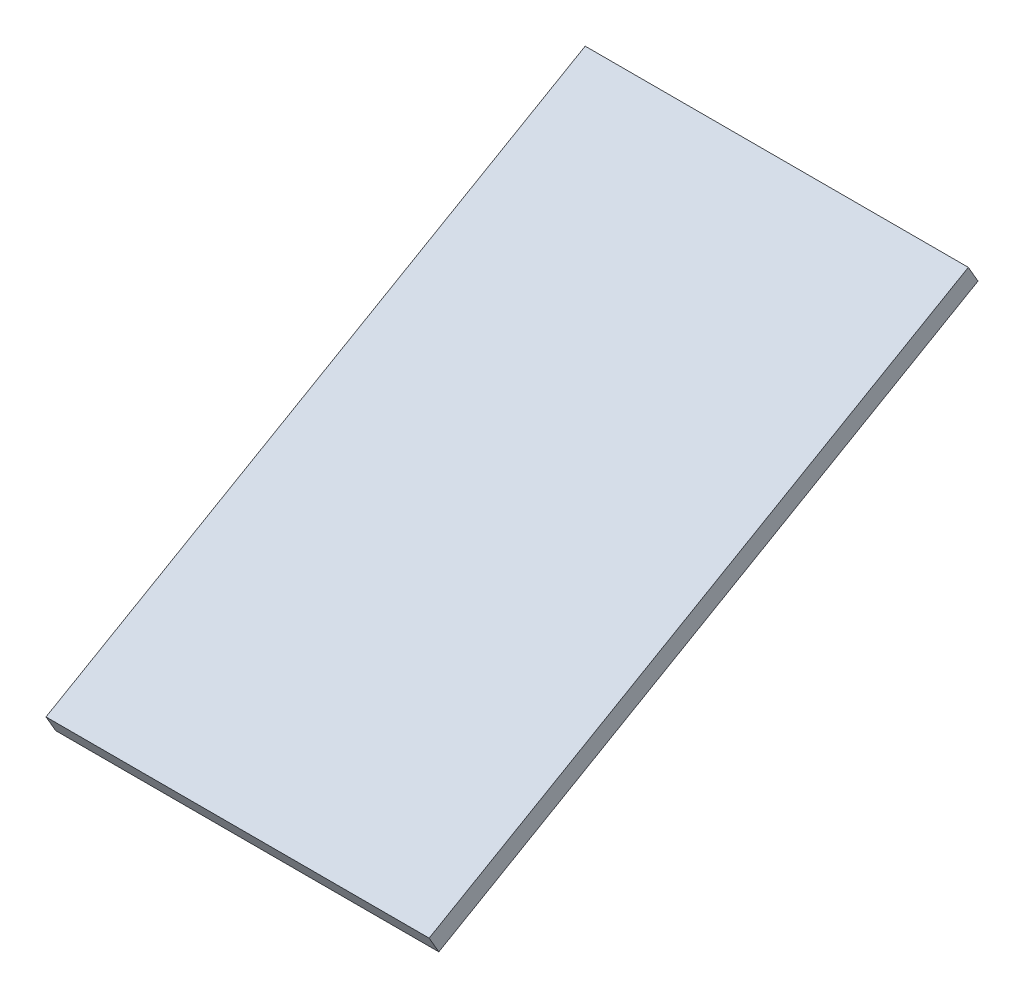
ISO-10303-21;
HEADER;
FILE_DESCRIPTION(('STEP AP214'),'2;1');
FILE_NAME('part.step','',(''),(''),'','','');
FILE_SCHEMA(('AUTOMOTIVE_DESIGN { 1 0 10303 214 1 1 1 1 }'));
ENDSEC;
DATA;
#1=APPLICATION_CONTEXT('core data for automotive mechanical design processes');
#2=APPLICATION_PROTOCOL_DEFINITION('international standard','automotive_design',2000,#1);
#3=PRODUCT_CONTEXT('',#1,'mechanical');
#4=PRODUCT('Part','Part','',(#3));
#5=PRODUCT_RELATED_PRODUCT_CATEGORY('part','',(#4));
#6=PRODUCT_DEFINITION_FORMATION('','',#4);
#7=PRODUCT_DEFINITION_CONTEXT('part definition',#1,'design');
#8=PRODUCT_DEFINITION('design','',#6,#7);
#9=PRODUCT_DEFINITION_SHAPE('','',#8);
#10=(LENGTH_UNIT() NAMED_UNIT(*) SI_UNIT(.MILLI.,.METRE.));
#11=(NAMED_UNIT(*) PLANE_ANGLE_UNIT() SI_UNIT($,.RADIAN.));
#12=(NAMED_UNIT(*) SI_UNIT($,.STERADIAN.) SOLID_ANGLE_UNIT());
#13=UNCERTAINTY_MEASURE_WITH_UNIT(LENGTH_MEASURE(1.E-05),#10,'distance_accuracy_value','');
#14=(GEOMETRIC_REPRESENTATION_CONTEXT(3) GLOBAL_UNCERTAINTY_ASSIGNED_CONTEXT((#13)) GLOBAL_UNIT_ASSIGNED_CONTEXT((#10,
#11,#12)) REPRESENTATION_CONTEXT('',''));
#15=CARTESIAN_POINT('',(0.,0.,0.));
#16=DIRECTION('',(0.,0.,1.));
#17=DIRECTION('',(1.,0.,0.));
#18=AXIS2_PLACEMENT_3D('',#15,#16,#17);
#19=CARTESIAN_POINT('',(1016.,0.,0.));
#20=DIRECTION('',(0.,0.499999999999995,-0.866025403784441));
#21=DIRECTION('',(0.,0.866025403784441,0.499999999999995));
#22=AXIS2_PLACEMENT_3D('',#19,#20,#21);
#23=PLANE('',#22);
#24=DIRECTION('',(0.,-0.866025403784441,-0.499999999999995));
#25=VECTOR('',#24,1.);
#26=CARTESIAN_POINT('',(0.,0.,0.));
#27=LINE('',#26,#25);
#28=CARTESIAN_POINT('',(0.,44.4277187977185,25.6503554073434));
#29=VERTEX_POINT('',#28);
#30=CARTESIAN_POINT('',(0.,0.,0.));
#31=VERTEX_POINT('',#30);
#32=EDGE_CURVE('E100',#29,#31,#27,.T.);
#33=ORIENTED_EDGE('',*,*,#32,.T.);
#34=DIRECTION('',(-1.,0.,0.));
#35=VECTOR('',#34,1.);
#36=CARTESIAN_POINT('',(1016.,0.,0.));
#37=LINE('',#36,#35);
#38=CARTESIAN_POINT('',(1016.,0.,0.));
#39=VERTEX_POINT('',#38);
#40=EDGE_CURVE('E11',#39,#31,#37,.T.);
#41=ORIENTED_EDGE('',*,*,#40,.F.);
#42=DIRECTION('',(0.,-0.866025403784441,-0.499999999999995));
#43=VECTOR('',#42,1.);
#44=CARTESIAN_POINT('',(1016.,0.,0.));
#45=LINE('',#44,#43);
#46=CARTESIAN_POINT('',(1016.,44.4277187977185,25.6503554073434));
#47=VERTEX_POINT('',#46);
#48=EDGE_CURVE('E88',#47,#39,#45,.T.);
#49=ORIENTED_EDGE('',*,*,#48,.F.);
#50=DIRECTION('',(-1.,0.,0.));
#51=VECTOR('',#50,1.);
#52=CARTESIAN_POINT('',(1016.,44.4277187977185,25.6503554073434));
#53=LINE('',#52,#51);
#54=EDGE_CURVE('E96',#47,#29,#53,.T.);
#55=ORIENTED_EDGE('',*,*,#54,.T.);
#56=EDGE_LOOP('',(#33,#41,#49,#55));
#57=FACE_BOUND('',#56,.T.);
#58=ADVANCED_FACE('F37',(#57),#23,.F.);
#59=CARTESIAN_POINT('',(1016.,0.,0.));
#60=DIRECTION('',(0.,0.866025403784441,0.499999999999995));
#61=DIRECTION('',(0.,-0.499999999999995,0.866025403784441));
#62=AXIS2_PLACEMENT_3D('',#59,#60,#61);
#63=PLANE('',#62);
#64=DIRECTION('',(0.,0.499999999999995,-0.866025403784441));
#65=VECTOR('',#64,1.);
#66=CARTESIAN_POINT('',(0.,0.,0.));
#67=LINE('',#66,#65);
#68=CARTESIAN_POINT('',(0.,825.499999999992,-1429.80794164811));
#69=VERTEX_POINT('',#68);
#70=EDGE_CURVE('E92',#31,#69,#67,.T.);
#71=ORIENTED_EDGE('',*,*,#70,.T.);
#72=DIRECTION('',(-1.,0.,0.));
#73=VECTOR('',#72,1.);
#74=CARTESIAN_POINT('',(1016.,825.499999999992,-1429.80794164811));
#75=LINE('',#74,#73);
#76=CARTESIAN_POINT('',(1016.,825.499999999992,-1429.80794164811));
#77=VERTEX_POINT('',#76);
#78=EDGE_CURVE('E45',#77,#69,#75,.T.);
#79=ORIENTED_EDGE('',*,*,#78,.F.);
#80=DIRECTION('',(0.,0.499999999999995,-0.866025403784441));
#81=VECTOR('',#80,1.);
#82=CARTESIAN_POINT('',(1016.,0.,0.));
#83=LINE('',#82,#81);
#84=EDGE_CURVE('E83',#39,#77,#83,.T.);
#85=ORIENTED_EDGE('',*,*,#84,.F.);
#86=ORIENTED_EDGE('',*,*,#40,.T.);
#87=EDGE_LOOP('',(#71,#79,#85,#86));
#88=FACE_BOUND('',#87,.T.);
#89=ADVANCED_FACE('F91',(#88),#63,.F.);
#90=CARTESIAN_POINT('',(1016.,825.499999999992,-1429.80794164811));
#91=DIRECTION('',(0.,-0.499999999999989,0.866025403784445));
#92=DIRECTION('',(0.,-0.866025403784445,-0.499999999999989));
#93=AXIS2_PLACEMENT_3D('',#90,#91,#92);
#94=PLANE('',#93);
#95=DIRECTION('',(0.,0.866025403784445,0.499999999999989));
#96=VECTOR('',#95,1.);
#97=CARTESIAN_POINT('',(0.,825.499999999992,-1429.80794164811));
#98=LINE('',#97,#96);
#99=CARTESIAN_POINT('',(0.,869.92771879771,-1404.15758624077));
#100=VERTEX_POINT('',#99);
#101=EDGE_CURVE('E70',#69,#100,#98,.T.);
#102=ORIENTED_EDGE('',*,*,#101,.T.);
#103=DIRECTION('',(-1.,0.,0.));
#104=VECTOR('',#103,1.);
#105=CARTESIAN_POINT('',(1016.,869.92771879771,-1404.15758624077));
#106=LINE('',#105,#104);
#107=CARTESIAN_POINT('',(1016.,869.92771879771,-1404.15758624077));
#108=VERTEX_POINT('',#107);
#109=EDGE_CURVE('E93',#108,#100,#106,.T.);
#110=ORIENTED_EDGE('',*,*,#109,.F.);
#111=DIRECTION('',(0.,0.866025403784445,0.499999999999989));
#112=VECTOR('',#111,1.);
#113=CARTESIAN_POINT('',(1016.,825.499999999992,-1429.80794164811));
#114=LINE('',#113,#112);
#115=EDGE_CURVE('E86',#77,#108,#114,.T.);
#116=ORIENTED_EDGE('',*,*,#115,.F.);
#117=ORIENTED_EDGE('',*,*,#78,.T.);
#118=EDGE_LOOP('',(#102,#110,#116,#117));
#119=FACE_BOUND('',#118,.T.);
#120=ADVANCED_FACE('F94',(#119),#94,.F.);
#121=CARTESIAN_POINT('',(1016.,44.4277187977185,25.6503554073434));
#122=DIRECTION('',(0.,-0.866025403784441,-0.499999999999995));
#123=DIRECTION('',(0.,0.499999999999995,-0.866025403784442));
#124=AXIS2_PLACEMENT_3D('',#121,#122,#123);
#125=PLANE('',#124);
#126=DIRECTION('',(0.,-0.499999999999995,0.866025403784441));
#127=VECTOR('',#126,1.);
#128=CARTESIAN_POINT('',(0.,44.4277187977185,25.6503554073434));
#129=LINE('',#128,#127);
#130=EDGE_CURVE('E76',#100,#29,#129,.T.);
#131=ORIENTED_EDGE('',*,*,#130,.T.);
#132=ORIENTED_EDGE('',*,*,#54,.F.);
#133=DIRECTION('',(0.,-0.499999999999995,0.866025403784441));
#134=VECTOR('',#133,1.);
#135=CARTESIAN_POINT('',(1016.,44.4277187977185,25.6503554073434));
#136=LINE('',#135,#134);
#137=EDGE_CURVE('E53',#108,#47,#136,.T.);
#138=ORIENTED_EDGE('',*,*,#137,.F.);
#139=ORIENTED_EDGE('',*,*,#109,.T.);
#140=EDGE_LOOP('',(#131,#132,#138,#139));
#141=FACE_BOUND('',#140,.T.);
#142=ADVANCED_FACE('F107',(#141),#125,.F.);
#143=CARTESIAN_POINT('',(1016.,0.,0.));
#144=DIRECTION('',(-1.,0.,0.));
#145=DIRECTION('',(0.,0.,1.));
#146=AXIS2_PLACEMENT_3D('',#143,#144,#145);
#147=PLANE('',#146);
#148=ORIENTED_EDGE('',*,*,#48,.T.);
#149=ORIENTED_EDGE('',*,*,#84,.T.);
#150=ORIENTED_EDGE('',*,*,#115,.T.);
#151=ORIENTED_EDGE('',*,*,#137,.T.);
#152=EDGE_LOOP('',(#148,#149,#150,#151));
#153=FACE_BOUND('',#152,.T.);
#154=ADVANCED_FACE('F84',(#153),#147,.F.);
#155=CARTESIAN_POINT('',(0.,0.,0.));
#156=DIRECTION('',(-1.,0.,0.));
#157=DIRECTION('',(0.,0.,1.));
#158=AXIS2_PLACEMENT_3D('',#155,#156,#157);
#159=PLANE('',#158);
#160=ORIENTED_EDGE('',*,*,#32,.F.);
#161=ORIENTED_EDGE('',*,*,#130,.F.);
#162=ORIENTED_EDGE('',*,*,#101,.F.);
#163=ORIENTED_EDGE('',*,*,#70,.F.);
#164=EDGE_LOOP('',(#160,#161,#162,#163));
#165=FACE_BOUND('',#164,.T.);
#166=ADVANCED_FACE('F110',(#165),#159,.T.);
#167=CLOSED_SHELL('',(#58,#89,#120,#142,#154,#166));
#168=MANIFOLD_SOLID_BREP('B2',#167);
#169=ADVANCED_BREP_SHAPE_REPRESENTATION('',(#18,#168),#14);
#170=SHAPE_DEFINITION_REPRESENTATION(#9,#169);
ENDSEC;
END-ISO-10303-21;
